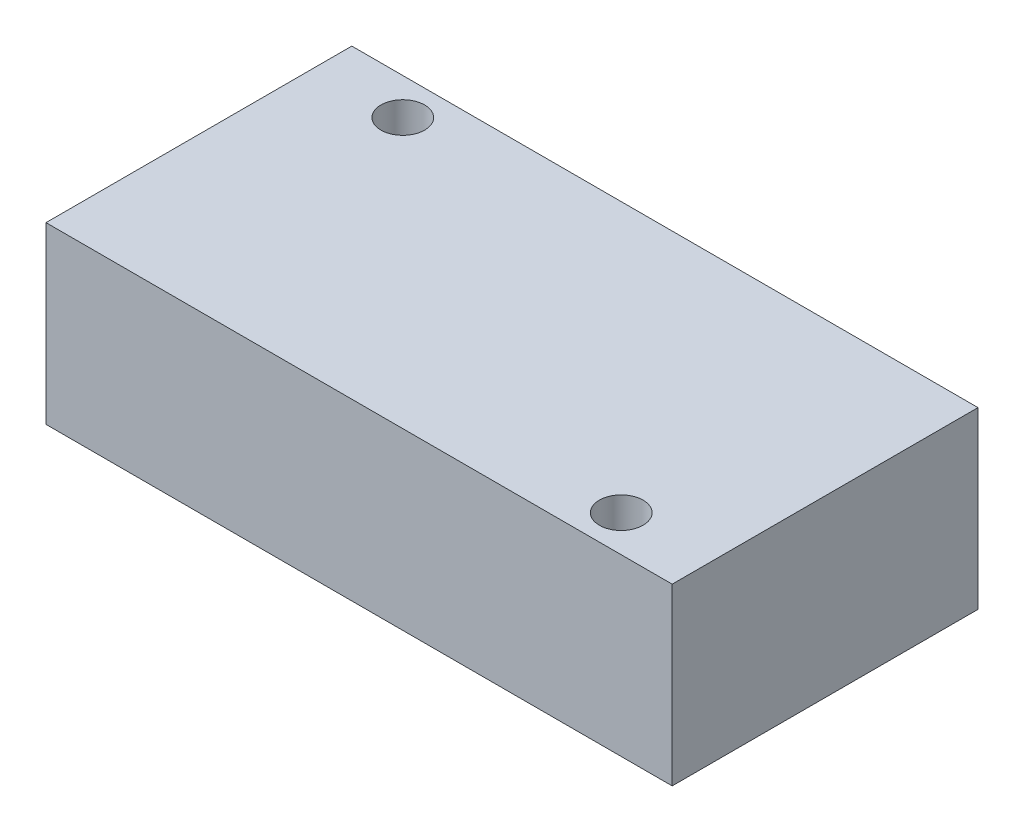
ISO-10303-21;
HEADER;
FILE_DESCRIPTION(('STEP AP214'),'2;1');
FILE_NAME('part.step','',(''),(''),'','','');
FILE_SCHEMA(('AUTOMOTIVE_DESIGN { 1 0 10303 214 1 1 1 1 }'));
ENDSEC;
DATA;
#1=APPLICATION_CONTEXT('core data for automotive mechanical design processes');
#2=APPLICATION_PROTOCOL_DEFINITION('international standard','automotive_design',2000,#1);
#3=PRODUCT_CONTEXT('',#1,'mechanical');
#4=PRODUCT('Part','Part','',(#3));
#5=PRODUCT_RELATED_PRODUCT_CATEGORY('part','',(#4));
#6=PRODUCT_DEFINITION_FORMATION('','',#4);
#7=PRODUCT_DEFINITION_CONTEXT('part definition',#1,'design');
#8=PRODUCT_DEFINITION('design','',#6,#7);
#9=PRODUCT_DEFINITION_SHAPE('','',#8);
#10=(LENGTH_UNIT() NAMED_UNIT(*) SI_UNIT(.MILLI.,.METRE.));
#11=(NAMED_UNIT(*) PLANE_ANGLE_UNIT() SI_UNIT($,.RADIAN.));
#12=(NAMED_UNIT(*) SI_UNIT($,.STERADIAN.) SOLID_ANGLE_UNIT());
#13=UNCERTAINTY_MEASURE_WITH_UNIT(LENGTH_MEASURE(1.E-05),#10,'distance_accuracy_value','');
#14=(GEOMETRIC_REPRESENTATION_CONTEXT(3) GLOBAL_UNCERTAINTY_ASSIGNED_CONTEXT((#13)) GLOBAL_UNIT_ASSIGNED_CONTEXT((#10,
#11,#12)) REPRESENTATION_CONTEXT('',''));
#15=CARTESIAN_POINT('',(0.,0.,0.));
#16=DIRECTION('',(0.,0.,1.));
#17=DIRECTION('',(1.,0.,0.));
#18=AXIS2_PLACEMENT_3D('',#15,#16,#17);
#19=CARTESIAN_POINT('',(0.,12.,0.));
#20=DIRECTION('',(0.,-1.,0.));
#21=DIRECTION('',(0.,0.,-1.));
#22=AXIS2_PLACEMENT_3D('',#19,#20,#21);
#23=PLANE('',#22);
#24=DIRECTION('',(0.,0.,-1.));
#25=VECTOR('',#24,1.);
#26=CARTESIAN_POINT('',(21.5,12.,10.5));
#27=LINE('',#26,#25);
#28=CARTESIAN_POINT('',(21.5,12.,10.5));
#29=VERTEX_POINT('',#28);
#30=CARTESIAN_POINT('',(21.5,12.,-10.5));
#31=VERTEX_POINT('',#30);
#32=EDGE_CURVE('E89',#29,#31,#27,.T.);
#33=ORIENTED_EDGE('',*,*,#32,.T.);
#34=DIRECTION('',(-1.,0.,0.));
#35=VECTOR('',#34,1.);
#36=CARTESIAN_POINT('',(-21.5,12.,-10.5));
#37=LINE('',#36,#35);
#38=CARTESIAN_POINT('',(-21.5,12.,-10.5));
#39=VERTEX_POINT('',#38);
#40=EDGE_CURVE('E84',#31,#39,#37,.T.);
#41=ORIENTED_EDGE('',*,*,#40,.T.);
#42=DIRECTION('',(0.,0.,1.));
#43=VECTOR('',#42,1.);
#44=CARTESIAN_POINT('',(-21.5,12.,10.5));
#45=LINE('',#44,#43);
#46=CARTESIAN_POINT('',(-21.5,12.,10.5));
#47=VERTEX_POINT('',#46);
#48=EDGE_CURVE('E87',#39,#47,#45,.T.);
#49=ORIENTED_EDGE('',*,*,#48,.T.);
#50=DIRECTION('',(1.,0.,0.));
#51=VECTOR('',#50,1.);
#52=CARTESIAN_POINT('',(-21.5,12.,10.5));
#53=LINE('',#52,#51);
#54=EDGE_CURVE('E54',#47,#29,#53,.T.);
#55=ORIENTED_EDGE('',*,*,#54,.T.);
#56=EDGE_LOOP('',(#33,#41,#49,#55));
#57=FACE_BOUND('',#56,.T.);
#58=CARTESIAN_POINT('',(-15.5,12.,-8.));
#59=DIRECTION('',(0.,1.,0.));
#60=DIRECTION('',(0.,0.,1.));
#61=AXIS2_PLACEMENT_3D('',#58,#59,#60);
#62=CIRCLE('',#61,1.5);
#63=CARTESIAN_POINT('',(-15.5,12.,-6.5));
#64=VERTEX_POINT('',#63);
#65=EDGE_CURVE('E104',#64,#64,#62,.T.);
#66=ORIENTED_EDGE('',*,*,#65,.F.);
#67=EDGE_LOOP('',(#66));
#68=FACE_BOUND('',#67,.T.);
#69=CARTESIAN_POINT('',(15.5,12.,8.));
#70=DIRECTION('',(0.,1.,0.));
#71=DIRECTION('',(0.,0.,1.));
#72=AXIS2_PLACEMENT_3D('',#69,#70,#71);
#73=CIRCLE('',#72,1.5);
#74=CARTESIAN_POINT('',(15.5,12.,9.5));
#75=VERTEX_POINT('',#74);
#76=EDGE_CURVE('E119',#75,#75,#73,.T.);
#77=ORIENTED_EDGE('',*,*,#76,.F.);
#78=EDGE_LOOP('',(#77));
#79=FACE_BOUND('',#78,.T.);
#80=ADVANCED_FACE('F37',(#57,#68,#79),#23,.F.);
#81=CARTESIAN_POINT('',(0.,0.,0.));
#82=DIRECTION('',(0.,-1.,0.));
#83=DIRECTION('',(0.,0.,-1.));
#84=AXIS2_PLACEMENT_3D('',#81,#82,#83);
#85=PLANE('',#84);
#86=CARTESIAN_POINT('',(-15.5,0.,-8.));
#87=DIRECTION('',(0.,1.,0.));
#88=DIRECTION('',(0.,0.,1.));
#89=AXIS2_PLACEMENT_3D('',#86,#87,#88);
#90=CIRCLE('',#89,1.5);
#91=CARTESIAN_POINT('',(-15.5,0.,-6.5));
#92=VERTEX_POINT('',#91);
#93=EDGE_CURVE('E116',#92,#92,#90,.T.);
#94=ORIENTED_EDGE('',*,*,#93,.T.);
#95=EDGE_LOOP('',(#94));
#96=FACE_BOUND('',#95,.T.);
#97=DIRECTION('',(0.,0.,-1.));
#98=VECTOR('',#97,1.);
#99=CARTESIAN_POINT('',(21.5,0.,10.5));
#100=LINE('',#99,#98);
#101=CARTESIAN_POINT('',(21.5,0.,10.5));
#102=VERTEX_POINT('',#101);
#103=CARTESIAN_POINT('',(21.5,0.,-10.5));
#104=VERTEX_POINT('',#103);
#105=EDGE_CURVE('E101',#102,#104,#100,.T.);
#106=ORIENTED_EDGE('',*,*,#105,.F.);
#107=DIRECTION('',(1.,0.,0.));
#108=VECTOR('',#107,1.);
#109=CARTESIAN_POINT('',(-21.5,0.,10.5));
#110=LINE('',#109,#108);
#111=CARTESIAN_POINT('',(-21.5,0.,10.5));
#112=VERTEX_POINT('',#111);
#113=EDGE_CURVE('E77',#112,#102,#110,.T.);
#114=ORIENTED_EDGE('',*,*,#113,.F.);
#115=DIRECTION('',(0.,0.,1.));
#116=VECTOR('',#115,1.);
#117=CARTESIAN_POINT('',(-21.5,0.,10.5));
#118=LINE('',#117,#116);
#119=CARTESIAN_POINT('',(-21.5,0.,-10.5));
#120=VERTEX_POINT('',#119);
#121=EDGE_CURVE('E71',#120,#112,#118,.T.);
#122=ORIENTED_EDGE('',*,*,#121,.F.);
#123=DIRECTION('',(-1.,0.,0.));
#124=VECTOR('',#123,1.);
#125=CARTESIAN_POINT('',(-21.5,0.,-10.5));
#126=LINE('',#125,#124);
#127=EDGE_CURVE('E93',#104,#120,#126,.T.);
#128=ORIENTED_EDGE('',*,*,#127,.F.);
#129=EDGE_LOOP('',(#106,#114,#122,#128));
#130=FACE_BOUND('',#129,.T.);
#131=CARTESIAN_POINT('',(15.5,0.,8.));
#132=DIRECTION('',(0.,1.,0.));
#133=DIRECTION('',(0.,0.,1.));
#134=AXIS2_PLACEMENT_3D('',#131,#132,#133);
#135=CIRCLE('',#134,1.5);
#136=CARTESIAN_POINT('',(15.5,0.,9.5));
#137=VERTEX_POINT('',#136);
#138=EDGE_CURVE('E122',#137,#137,#135,.T.);
#139=ORIENTED_EDGE('',*,*,#138,.T.);
#140=EDGE_LOOP('',(#139));
#141=FACE_BOUND('',#140,.T.);
#142=ADVANCED_FACE('F112',(#96,#130,#141),#85,.T.);
#143=CARTESIAN_POINT('',(21.5,12.,10.5));
#144=DIRECTION('',(-1.,0.,0.));
#145=DIRECTION('',(0.,0.,1.));
#146=AXIS2_PLACEMENT_3D('',#143,#144,#145);
#147=PLANE('',#146);
#148=ORIENTED_EDGE('',*,*,#105,.T.);
#149=DIRECTION('',(0.,-1.,0.));
#150=VECTOR('',#149,1.);
#151=CARTESIAN_POINT('',(21.5,12.,-10.5));
#152=LINE('',#151,#150);
#153=EDGE_CURVE('E11',#31,#104,#152,.T.);
#154=ORIENTED_EDGE('',*,*,#153,.F.);
#155=ORIENTED_EDGE('',*,*,#32,.F.);
#156=DIRECTION('',(0.,-1.,0.));
#157=VECTOR('',#156,1.);
#158=CARTESIAN_POINT('',(21.5,12.,10.5));
#159=LINE('',#158,#157);
#160=EDGE_CURVE('E97',#29,#102,#159,.T.);
#161=ORIENTED_EDGE('',*,*,#160,.T.);
#162=EDGE_LOOP('',(#148,#154,#155,#161));
#163=FACE_BOUND('',#162,.T.);
#164=ADVANCED_FACE('F39',(#163),#147,.F.);
#165=CARTESIAN_POINT('',(-21.5,12.,-10.5));
#166=DIRECTION('',(0.,0.,1.));
#167=DIRECTION('',(1.,0.,0.));
#168=AXIS2_PLACEMENT_3D('',#165,#166,#167);
#169=PLANE('',#168);
#170=ORIENTED_EDGE('',*,*,#127,.T.);
#171=DIRECTION('',(0.,-1.,0.));
#172=VECTOR('',#171,1.);
#173=CARTESIAN_POINT('',(-21.5,12.,-10.5));
#174=LINE('',#173,#172);
#175=EDGE_CURVE('E46',#39,#120,#174,.T.);
#176=ORIENTED_EDGE('',*,*,#175,.F.);
#177=ORIENTED_EDGE('',*,*,#40,.F.);
#178=ORIENTED_EDGE('',*,*,#153,.T.);
#179=EDGE_LOOP('',(#170,#176,#177,#178));
#180=FACE_BOUND('',#179,.T.);
#181=ADVANCED_FACE('F92',(#180),#169,.F.);
#182=CARTESIAN_POINT('',(-21.5,12.,10.5));
#183=DIRECTION('',(1.,0.,0.));
#184=DIRECTION('',(0.,0.,-1.));
#185=AXIS2_PLACEMENT_3D('',#182,#183,#184);
#186=PLANE('',#185);
#187=ORIENTED_EDGE('',*,*,#121,.T.);
#188=DIRECTION('',(0.,-1.,0.));
#189=VECTOR('',#188,1.);
#190=CARTESIAN_POINT('',(-21.5,12.,10.5));
#191=LINE('',#190,#189);
#192=EDGE_CURVE('E94',#47,#112,#191,.T.);
#193=ORIENTED_EDGE('',*,*,#192,.F.);
#194=ORIENTED_EDGE('',*,*,#48,.F.);
#195=ORIENTED_EDGE('',*,*,#175,.T.);
#196=EDGE_LOOP('',(#187,#193,#194,#195));
#197=FACE_BOUND('',#196,.T.);
#198=ADVANCED_FACE('F95',(#197),#186,.F.);
#199=CARTESIAN_POINT('',(-21.5,12.,10.5));
#200=DIRECTION('',(0.,0.,-1.));
#201=DIRECTION('',(-1.,0.,0.));
#202=AXIS2_PLACEMENT_3D('',#199,#200,#201);
#203=PLANE('',#202);
#204=ORIENTED_EDGE('',*,*,#113,.T.);
#205=ORIENTED_EDGE('',*,*,#160,.F.);
#206=ORIENTED_EDGE('',*,*,#54,.F.);
#207=ORIENTED_EDGE('',*,*,#192,.T.);
#208=EDGE_LOOP('',(#204,#205,#206,#207));
#209=FACE_BOUND('',#208,.T.);
#210=ADVANCED_FACE('F109',(#209),#203,.F.);
#211=CARTESIAN_POINT('',(-15.5,12.,-8.));
#212=DIRECTION('',(0.,-1.,0.));
#213=DIRECTION('',(0.,0.,-1.));
#214=AXIS2_PLACEMENT_3D('',#211,#212,#213);
#215=CYLINDRICAL_SURFACE('',#214,1.5);
#216=ORIENTED_EDGE('',*,*,#65,.T.);
#217=EDGE_LOOP('',(#216));
#218=FACE_BOUND('',#217,.T.);
#219=ORIENTED_EDGE('',*,*,#93,.F.);
#220=EDGE_LOOP('',(#219));
#221=FACE_BOUND('',#220,.T.);
#222=ADVANCED_FACE('F139',(#218,#221),#215,.F.);
#223=CARTESIAN_POINT('',(15.5,12.,8.));
#224=DIRECTION('',(0.,-1.,0.));
#225=DIRECTION('',(0.,0.,-1.));
#226=AXIS2_PLACEMENT_3D('',#223,#224,#225);
#227=CYLINDRICAL_SURFACE('',#226,1.5);
#228=ORIENTED_EDGE('',*,*,#76,.T.);
#229=EDGE_LOOP('',(#228));
#230=FACE_BOUND('',#229,.T.);
#231=ORIENTED_EDGE('',*,*,#138,.F.);
#232=EDGE_LOOP('',(#231));
#233=FACE_BOUND('',#232,.T.);
#234=ADVANCED_FACE('F128',(#230,#233),#227,.F.);
#235=CLOSED_SHELL('',(#80,#142,#164,#181,#198,#210,#222,#234));
#236=MANIFOLD_SOLID_BREP('B2',#235);
#237=ADVANCED_BREP_SHAPE_REPRESENTATION('',(#18,#236),#14);
#238=SHAPE_DEFINITION_REPRESENTATION(#9,#237);
ENDSEC;
END-ISO-10303-21;
